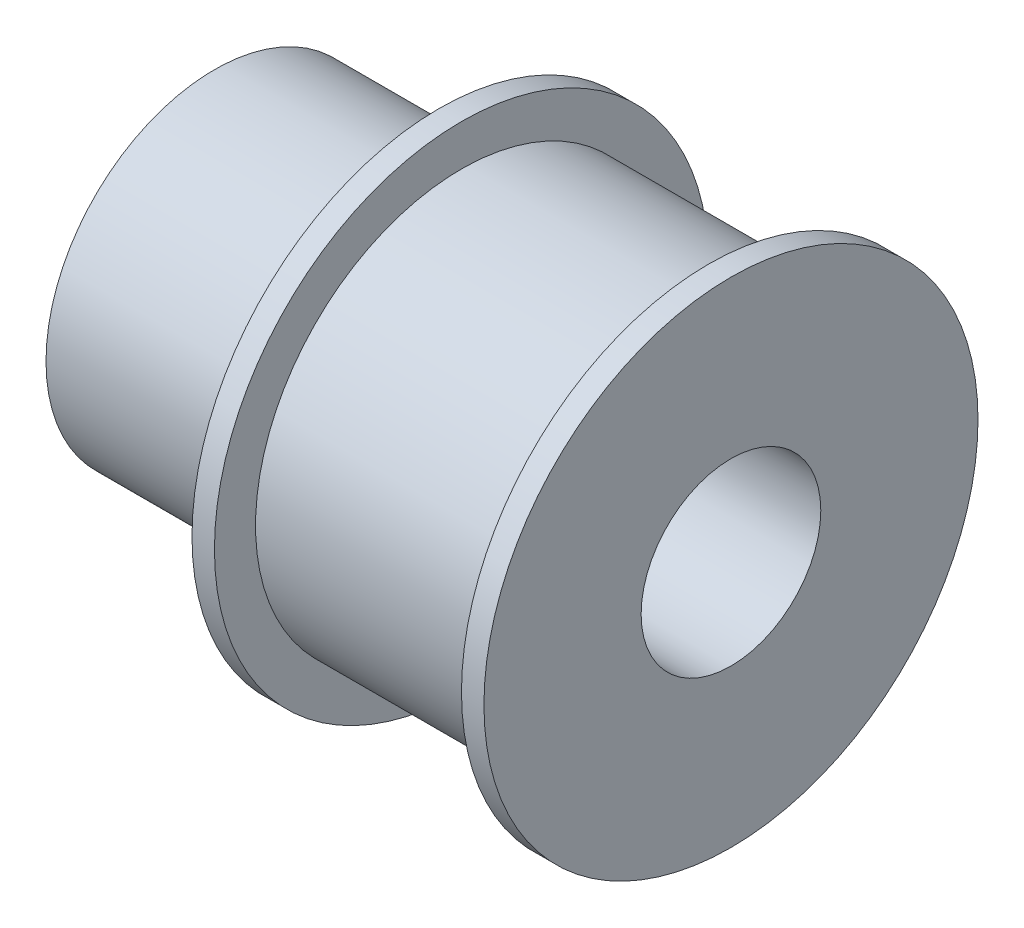
ISO-10303-21;
HEADER;
FILE_DESCRIPTION(('STEP AP214'),'2;1');
FILE_NAME('part.step','',(''),(''),'','','');
FILE_SCHEMA(('AUTOMOTIVE_DESIGN { 1 0 10303 214 1 1 1 1 }'));
ENDSEC;
DATA;
#1=APPLICATION_CONTEXT('core data for automotive mechanical design processes');
#2=APPLICATION_PROTOCOL_DEFINITION('international standard','automotive_design',2000,#1);
#3=PRODUCT_CONTEXT('',#1,'mechanical');
#4=PRODUCT('Part','Part','',(#3));
#5=PRODUCT_RELATED_PRODUCT_CATEGORY('part','',(#4));
#6=PRODUCT_DEFINITION_FORMATION('','',#4);
#7=PRODUCT_DEFINITION_CONTEXT('part definition',#1,'design');
#8=PRODUCT_DEFINITION('design','',#6,#7);
#9=PRODUCT_DEFINITION_SHAPE('','',#8);
#10=(LENGTH_UNIT() NAMED_UNIT(*) SI_UNIT(.MILLI.,.METRE.));
#11=(NAMED_UNIT(*) PLANE_ANGLE_UNIT() SI_UNIT($,.RADIAN.));
#12=(NAMED_UNIT(*) SI_UNIT($,.STERADIAN.) SOLID_ANGLE_UNIT());
#13=UNCERTAINTY_MEASURE_WITH_UNIT(LENGTH_MEASURE(1.E-05),#10,'distance_accuracy_value','');
#14=(GEOMETRIC_REPRESENTATION_CONTEXT(3) GLOBAL_UNCERTAINTY_ASSIGNED_CONTEXT((#13)) GLOBAL_UNIT_ASSIGNED_CONTEXT((#10,
#11,#12)) REPRESENTATION_CONTEXT('',''));
#15=CARTESIAN_POINT('',(0.,0.,0.));
#16=DIRECTION('',(0.,0.,1.));
#17=DIRECTION('',(1.,0.,0.));
#18=AXIS2_PLACEMENT_3D('',#15,#16,#17);
#19=CARTESIAN_POINT('',(13.,0.,0.));
#20=DIRECTION('',(-1.,0.,0.));
#21=DIRECTION('',(0.,0.,1.));
#22=AXIS2_PLACEMENT_3D('',#19,#20,#21);
#23=CYLINDRICAL_SURFACE('',#22,11.);
#24=CARTESIAN_POINT('',(0.,0.,0.));
#25=DIRECTION('',(1.,0.,0.));
#26=DIRECTION('',(0.,0.,-1.));
#27=AXIS2_PLACEMENT_3D('',#24,#25,#26);
#28=CIRCLE('',#27,11.);
#29=CARTESIAN_POINT('',(0.,0.,11.));
#30=VERTEX_POINT('',#29);
#31=EDGE_CURVE('E45',#30,#30,#28,.T.);
#32=CARTESIAN_POINT('',(1.,0.,0.));
#33=DIRECTION('',(1.,0.,0.));
#34=DIRECTION('',(0.,0.,-1.));
#35=AXIS2_PLACEMENT_3D('',#32,#33,#34);
#36=CIRCLE('',#35,11.);
#37=CARTESIAN_POINT('',(1.,0.,11.));
#38=VERTEX_POINT('',#37);
#39=EDGE_CURVE('E69',#38,#38,#36,.T.);
#40=CARTESIAN_POINT('',(0.,0.,11.));
#41=CARTESIAN_POINT('',(0.0104166666666667,0.,11.));
#42=CARTESIAN_POINT('',(0.0208333333333333,0.,11.));
#43=CARTESIAN_POINT('',(0.0416666666666667,0.,11.));
#44=CARTESIAN_POINT('',(0.0520833333333334,0.,11.));
#45=CARTESIAN_POINT('',(0.0729166666666667,0.,11.));
#46=CARTESIAN_POINT('',(0.0833333333333334,0.,11.));
#47=CARTESIAN_POINT('',(0.104166666666667,0.,11.));
#48=CARTESIAN_POINT('',(0.114583333333333,0.,11.));
#49=CARTESIAN_POINT('',(0.135416666666667,0.,11.));
#50=CARTESIAN_POINT('',(0.145833333333333,0.,11.));
#51=CARTESIAN_POINT('',(0.166666666666667,0.,11.));
#52=CARTESIAN_POINT('',(0.177083333333333,0.,11.));
#53=CARTESIAN_POINT('',(0.197916666666667,0.,11.));
#54=CARTESIAN_POINT('',(0.208333333333334,0.,11.));
#55=CARTESIAN_POINT('',(0.229166666666667,0.,11.));
#56=CARTESIAN_POINT('',(0.239583333333334,0.,11.));
#57=CARTESIAN_POINT('',(0.260416666666667,0.,11.));
#58=CARTESIAN_POINT('',(0.270833333333334,0.,11.));
#59=CARTESIAN_POINT('',(0.291666666666667,0.,11.));
#60=CARTESIAN_POINT('',(0.302083333333334,0.,11.));
#61=CARTESIAN_POINT('',(0.322916666666667,0.,11.));
#62=CARTESIAN_POINT('',(0.333333333333334,0.,11.));
#63=CARTESIAN_POINT('',(0.354166666666667,0.,11.));
#64=CARTESIAN_POINT('',(0.364583333333334,0.,11.));
#65=CARTESIAN_POINT('',(0.385416666666667,0.,11.));
#66=CARTESIAN_POINT('',(0.395833333333334,0.,11.));
#67=CARTESIAN_POINT('',(0.416666666666667,0.,11.));
#68=CARTESIAN_POINT('',(0.427083333333334,0.,11.));
#69=CARTESIAN_POINT('',(0.447916666666667,0.,11.));
#70=CARTESIAN_POINT('',(0.458333333333334,0.,11.));
#71=CARTESIAN_POINT('',(0.479166666666667,0.,11.));
#72=CARTESIAN_POINT('',(0.489583333333334,0.,11.));
#73=CARTESIAN_POINT('',(0.510416666666667,0.,11.));
#74=CARTESIAN_POINT('',(0.520833333333334,0.,11.));
#75=CARTESIAN_POINT('',(0.541666666666667,0.,11.));
#76=CARTESIAN_POINT('',(0.552083333333334,0.,11.));
#77=CARTESIAN_POINT('',(0.572916666666667,0.,11.));
#78=CARTESIAN_POINT('',(0.583333333333334,0.,11.));
#79=CARTESIAN_POINT('',(0.604166666666667,0.,11.));
#80=CARTESIAN_POINT('',(0.614583333333334,0.,11.));
#81=CARTESIAN_POINT('',(0.635416666666667,0.,11.));
#82=CARTESIAN_POINT('',(0.645833333333334,0.,11.));
#83=CARTESIAN_POINT('',(0.666666666666667,0.,11.));
#84=CARTESIAN_POINT('',(0.677083333333334,0.,11.));
#85=CARTESIAN_POINT('',(0.697916666666667,0.,11.));
#86=CARTESIAN_POINT('',(0.708333333333334,0.,11.));
#87=CARTESIAN_POINT('',(0.729166666666667,0.,11.));
#88=CARTESIAN_POINT('',(0.739583333333334,0.,11.));
#89=CARTESIAN_POINT('',(0.760416666666667,0.,11.));
#90=CARTESIAN_POINT('',(0.770833333333334,0.,11.));
#91=CARTESIAN_POINT('',(0.791666666666667,0.,11.));
#92=CARTESIAN_POINT('',(0.802083333333334,0.,11.));
#93=CARTESIAN_POINT('',(0.822916666666667,0.,11.));
#94=CARTESIAN_POINT('',(0.833333333333334,0.,11.));
#95=CARTESIAN_POINT('',(0.854166666666667,0.,11.));
#96=CARTESIAN_POINT('',(0.864583333333334,0.,11.));
#97=CARTESIAN_POINT('',(0.885416666666668,0.,11.));
#98=CARTESIAN_POINT('',(0.895833333333334,0.,11.));
#99=CARTESIAN_POINT('',(0.916666666666668,0.,11.));
#100=CARTESIAN_POINT('',(0.927083333333334,0.,11.));
#101=CARTESIAN_POINT('',(0.947916666666668,0.,11.));
#102=CARTESIAN_POINT('',(0.958333333333334,0.,11.));
#103=CARTESIAN_POINT('',(0.979166666666668,0.,11.));
#104=CARTESIAN_POINT('',(0.989583333333334,0.,11.));
#105=CARTESIAN_POINT('',(1.,0.,11.));
#106=B_SPLINE_CURVE_WITH_KNOTS('',3,(#40,#41,#42,#43,#44,#45,#46,#47,#48,#49,#50,#51,#52,#53,
#54,#55,#56,#57,#58,#59,#60,#61,#62,#63,#64,#65,#66,#67,#68,#69,#70,#71,#72,#73,#74,#75,#76,#77,
#78,#79,#80,#81,#82,#83,#84,#85,#86,#87,#88,#89,#90,#91,#92,#93,#94,#95,#96,#97,#98,#99,#100,
#101,#102,#103,#104,#105),.UNSPECIFIED.,.F.,.F.,(4,2,2,2,2,2,2,2,2,2,2,2,2,2,2,2,2,2,2,2,2,2,2,
2,2,2,2,2,2,2,2,2,4),(0.,0.03125,0.0625000000000001,0.0937500000000001,0.125,0.15625,0.1875,
0.21875,0.25,0.28125,0.3125,0.34375,0.375,0.40625,0.4375,0.46875,0.5,0.53125,0.5625,
0.593750000000001,0.625000000000001,0.656250000000001,0.687500000000001,0.718750000000001,
0.750000000000001,0.781250000000001,0.812500000000001,0.843750000000001,0.875000000000001,
0.906250000000001,0.937500000000001,0.968750000000001,1.),.UNSPECIFIED.);
#107=EDGE_CURVE('BSEAM41',#30,#38,#106,.T.);
#108=ORIENTED_EDGE('',*,*,#31,.T.);
#109=ORIENTED_EDGE('',*,*,#39,.F.);
#110=ORIENTED_EDGE('',*,*,#107,.T.);
#111=ORIENTED_EDGE('',*,*,#107,.F.);
#112=EDGE_LOOP('',(#108,#110,#109,#111));
#113=FACE_BOUND('',#112,.T.);
#114=ADVANCED_FACE('F41',(#113),#23,.T.);
#115=CARTESIAN_POINT('',(0.,0.,0.));
#116=DIRECTION('',(1.,0.,0.));
#117=DIRECTION('',(0.,0.,-1.));
#118=AXIS2_PLACEMENT_3D('',#115,#116,#117);
#119=PLANE('',#118);
#120=CARTESIAN_POINT('',(0.,0.,0.));
#121=DIRECTION('',(-1.,0.,0.));
#122=DIRECTION('',(0.,0.,1.));
#123=AXIS2_PLACEMENT_3D('',#120,#121,#122);
#124=CIRCLE('',#123,7.5);
#125=CARTESIAN_POINT('',(0.,0.,7.5));
#126=VERTEX_POINT('',#125);
#127=EDGE_CURVE('E10',#126,#126,#124,.T.);
#128=ORIENTED_EDGE('',*,*,#127,.F.);
#129=EDGE_LOOP('',(#128));
#130=FACE_BOUND('',#129,.T.);
#131=ORIENTED_EDGE('',*,*,#31,.F.);
#132=EDGE_LOOP('',(#131));
#133=FACE_BOUND('',#132,.T.);
#134=ADVANCED_FACE('F92',(#130,#133),#119,.F.);
#135=CARTESIAN_POINT('',(1.,0.,0.));
#136=DIRECTION('',(1.,0.,0.));
#137=DIRECTION('',(0.,0.,-1.));
#138=AXIS2_PLACEMENT_3D('',#135,#136,#137);
#139=PLANE('',#138);
#140=CARTESIAN_POINT('',(1.,0.,0.));
#141=DIRECTION('',(1.,0.,0.));
#142=DIRECTION('',(0.,0.,-1.));
#143=AXIS2_PLACEMENT_3D('',#140,#141,#142);
#144=CIRCLE('',#143,9.17);
#145=CARTESIAN_POINT('',(1.,0.,-9.17));
#146=VERTEX_POINT('',#145);
#147=EDGE_CURVE('E60',#146,#146,#144,.T.);
#148=ORIENTED_EDGE('',*,*,#147,.F.);
#149=EDGE_LOOP('',(#148));
#150=FACE_BOUND('',#149,.T.);
#151=ORIENTED_EDGE('',*,*,#39,.T.);
#152=EDGE_LOOP('',(#151));
#153=FACE_BOUND('',#152,.T.);
#154=ADVANCED_FACE('F82',(#150,#153),#139,.T.);
#155=CARTESIAN_POINT('',(12.,0.,0.));
#156=DIRECTION('',(1.,0.,0.));
#157=DIRECTION('',(0.,0.,-1.));
#158=AXIS2_PLACEMENT_3D('',#155,#156,#157);
#159=PLANE('',#158);
#160=CARTESIAN_POINT('',(12.,0.,0.));
#161=DIRECTION('',(1.,0.,0.));
#162=DIRECTION('',(0.,0.,-1.));
#163=AXIS2_PLACEMENT_3D('',#160,#161,#162);
#164=CIRCLE('',#163,9.17);
#165=CARTESIAN_POINT('',(12.,0.,-9.17));
#166=VERTEX_POINT('',#165);
#167=EDGE_CURVE('E65',#166,#166,#164,.T.);
#168=ORIENTED_EDGE('',*,*,#167,.T.);
#169=EDGE_LOOP('',(#168));
#170=FACE_BOUND('',#169,.T.);
#171=CARTESIAN_POINT('',(12.,0.,0.));
#172=DIRECTION('',(1.,0.,0.));
#173=DIRECTION('',(0.,0.,-1.));
#174=AXIS2_PLACEMENT_3D('',#171,#172,#173);
#175=CIRCLE('',#174,11.);
#176=CARTESIAN_POINT('',(12.,0.,11.));
#177=VERTEX_POINT('',#176);
#178=EDGE_CURVE('E64',#177,#177,#175,.T.);
#179=ORIENTED_EDGE('',*,*,#178,.F.);
#180=EDGE_LOOP('',(#179));
#181=FACE_BOUND('',#180,.T.);
#182=ADVANCED_FACE('F79',(#170,#181),#159,.F.);
#183=CARTESIAN_POINT('',(1.,0.,0.));
#184=DIRECTION('',(1.,0.,0.));
#185=DIRECTION('',(0.,0.,-1.));
#186=AXIS2_PLACEMENT_3D('',#183,#184,#185);
#187=CYLINDRICAL_SURFACE('',#186,9.17);
#188=ORIENTED_EDGE('',*,*,#147,.T.);
#189=EDGE_LOOP('',(#188));
#190=FACE_BOUND('',#189,.T.);
#191=ORIENTED_EDGE('',*,*,#167,.F.);
#192=EDGE_LOOP('',(#191));
#193=FACE_BOUND('',#192,.T.);
#194=ADVANCED_FACE('F81',(#190,#193),#187,.T.);
#195=CARTESIAN_POINT('',(13.,0.,0.));
#196=DIRECTION('',(1.,0.,0.));
#197=DIRECTION('',(0.,0.,-1.));
#198=AXIS2_PLACEMENT_3D('',#195,#196,#197);
#199=PLANE('',#198);
#200=CARTESIAN_POINT('',(13.,0.,0.));
#201=DIRECTION('',(1.,0.,0.));
#202=DIRECTION('',(0.,0.,-1.));
#203=AXIS2_PLACEMENT_3D('',#200,#201,#202);
#204=CIRCLE('',#203,4.);
#205=CARTESIAN_POINT('',(13.,0.,-4.));
#206=VERTEX_POINT('',#205);
#207=EDGE_CURVE('E119',#206,#206,#204,.F.);
#208=ORIENTED_EDGE('',*,*,#207,.T.);
#209=EDGE_LOOP('',(#208));
#210=FACE_BOUND('',#209,.T.);
#211=CARTESIAN_POINT('',(13.,0.,0.));
#212=DIRECTION('',(1.,0.,0.));
#213=DIRECTION('',(0.,0.,-1.));
#214=AXIS2_PLACEMENT_3D('',#211,#212,#213);
#215=CIRCLE('',#214,11.);
#216=CARTESIAN_POINT('',(13.,0.,11.));
#217=VERTEX_POINT('',#216);
#218=EDGE_CURVE('E50',#217,#217,#215,.T.);
#219=ORIENTED_EDGE('',*,*,#218,.T.);
#220=EDGE_LOOP('',(#219));
#221=FACE_BOUND('',#220,.T.);
#222=ADVANCED_FACE('F89',(#210,#221),#199,.T.);
#223=CARTESIAN_POINT('',(12.,0.,11.));
#224=CARTESIAN_POINT('',(12.0104166666667,0.,11.));
#225=CARTESIAN_POINT('',(12.0208333333333,0.,11.));
#226=CARTESIAN_POINT('',(12.0416666666667,0.,11.));
#227=CARTESIAN_POINT('',(12.0520833333333,0.,11.));
#228=CARTESIAN_POINT('',(12.0729166666667,0.,11.));
#229=CARTESIAN_POINT('',(12.0833333333333,0.,11.));
#230=CARTESIAN_POINT('',(12.1041666666667,0.,11.));
#231=CARTESIAN_POINT('',(12.1145833333333,0.,11.));
#232=CARTESIAN_POINT('',(12.1354166666667,0.,11.));
#233=CARTESIAN_POINT('',(12.1458333333333,0.,11.));
#234=CARTESIAN_POINT('',(12.1666666666667,0.,11.));
#235=CARTESIAN_POINT('',(12.1770833333333,0.,11.));
#236=CARTESIAN_POINT('',(12.1979166666667,0.,11.));
#237=CARTESIAN_POINT('',(12.2083333333333,0.,11.));
#238=CARTESIAN_POINT('',(12.2291666666667,0.,11.));
#239=CARTESIAN_POINT('',(12.2395833333333,0.,11.));
#240=CARTESIAN_POINT('',(12.2604166666667,0.,11.));
#241=CARTESIAN_POINT('',(12.2708333333333,0.,11.));
#242=CARTESIAN_POINT('',(12.2916666666667,0.,11.));
#243=CARTESIAN_POINT('',(12.3020833333333,0.,11.));
#244=CARTESIAN_POINT('',(12.3229166666667,0.,11.));
#245=CARTESIAN_POINT('',(12.3333333333333,0.,11.));
#246=CARTESIAN_POINT('',(12.3541666666667,0.,11.));
#247=CARTESIAN_POINT('',(12.3645833333333,0.,11.));
#248=CARTESIAN_POINT('',(12.3854166666667,0.,11.));
#249=CARTESIAN_POINT('',(12.3958333333333,0.,11.));
#250=CARTESIAN_POINT('',(12.4166666666667,0.,11.));
#251=CARTESIAN_POINT('',(12.4270833333333,0.,11.));
#252=CARTESIAN_POINT('',(12.4479166666667,0.,11.));
#253=CARTESIAN_POINT('',(12.4583333333333,0.,11.));
#254=CARTESIAN_POINT('',(12.4791666666667,0.,11.));
#255=CARTESIAN_POINT('',(12.4895833333333,0.,11.));
#256=CARTESIAN_POINT('',(12.5104166666667,0.,11.));
#257=CARTESIAN_POINT('',(12.5208333333333,0.,11.));
#258=CARTESIAN_POINT('',(12.5416666666667,0.,11.));
#259=CARTESIAN_POINT('',(12.5520833333333,0.,11.));
#260=CARTESIAN_POINT('',(12.5729166666667,0.,11.));
#261=CARTESIAN_POINT('',(12.5833333333333,0.,11.));
#262=CARTESIAN_POINT('',(12.6041666666667,0.,11.));
#263=CARTESIAN_POINT('',(12.6145833333333,0.,11.));
#264=CARTESIAN_POINT('',(12.6354166666667,0.,11.));
#265=CARTESIAN_POINT('',(12.6458333333333,0.,11.));
#266=CARTESIAN_POINT('',(12.6666666666667,0.,11.));
#267=CARTESIAN_POINT('',(12.6770833333333,0.,11.));
#268=CARTESIAN_POINT('',(12.6979166666667,0.,11.));
#269=CARTESIAN_POINT('',(12.7083333333333,0.,11.));
#270=CARTESIAN_POINT('',(12.7291666666667,0.,11.));
#271=CARTESIAN_POINT('',(12.7395833333333,0.,11.));
#272=CARTESIAN_POINT('',(12.7604166666667,0.,11.));
#273=CARTESIAN_POINT('',(12.7708333333333,0.,11.));
#274=CARTESIAN_POINT('',(12.7916666666667,0.,11.));
#275=CARTESIAN_POINT('',(12.8020833333333,0.,11.));
#276=CARTESIAN_POINT('',(12.8229166666667,0.,11.));
#277=CARTESIAN_POINT('',(12.8333333333333,0.,11.));
#278=CARTESIAN_POINT('',(12.8541666666667,0.,11.));
#279=CARTESIAN_POINT('',(12.8645833333333,0.,11.));
#280=CARTESIAN_POINT('',(12.8854166666667,0.,11.));
#281=CARTESIAN_POINT('',(12.8958333333333,0.,11.));
#282=CARTESIAN_POINT('',(12.9166666666667,0.,11.));
#283=CARTESIAN_POINT('',(12.9270833333333,0.,11.));
#284=CARTESIAN_POINT('',(12.9479166666667,0.,11.));
#285=CARTESIAN_POINT('',(12.9583333333333,0.,11.));
#286=CARTESIAN_POINT('',(12.9791666666667,0.,11.));
#287=CARTESIAN_POINT('',(12.9895833333333,0.,11.));
#288=CARTESIAN_POINT('',(13.,0.,11.));
#289=B_SPLINE_CURVE_WITH_KNOTS('',3,(#223,#224,#225,#226,#227,#228,#229,#230,#231,#232,#233,
#234,#235,#236,#237,#238,#239,#240,#241,#242,#243,#244,#245,#246,#247,#248,#249,#250,#251,#252,
#253,#254,#255,#256,#257,#258,#259,#260,#261,#262,#263,#264,#265,#266,#267,#268,#269,#270,#271,
#272,#273,#274,#275,#276,#277,#278,#279,#280,#281,#282,#283,#284,#285,#286,#287,#288),
.UNSPECIFIED.,.F.,.F.,(4,2,2,2,2,2,2,2,2,2,2,2,2,2,2,2,2,2,2,2,2,2,2,2,2,2,2,2,2,2,2,2,4),(0.,
0.03125,0.0625000000000001,0.0937500000000001,0.125,0.15625,0.1875,0.21875,0.25,0.28125,0.3125,
0.34375,0.375,0.40625,0.4375,0.46875,0.5,0.53125,0.5625,0.593750000000001,0.625000000000001,
0.656250000000001,0.687500000000001,0.718750000000001,0.750000000000001,0.781250000000001,
0.812500000000001,0.843750000000001,0.875000000000001,0.906250000000001,0.937500000000001,
0.968750000000001,1.),.UNSPECIFIED.);
#290=EDGE_CURVE('BSEAM43',#177,#217,#289,.T.);
#291=ORIENTED_EDGE('',*,*,#178,.T.);
#292=ORIENTED_EDGE('',*,*,#218,.F.);
#293=ORIENTED_EDGE('',*,*,#290,.T.);
#294=ORIENTED_EDGE('',*,*,#290,.F.);
#295=EDGE_LOOP('',(#291,#293,#292,#294));
#296=FACE_BOUND('',#295,.T.);
#297=ADVANCED_FACE('F43',(#296),#23,.T.);
#298=CARTESIAN_POINT('',(-10.,0.,0.));
#299=DIRECTION('',(1.,0.,0.));
#300=DIRECTION('',(0.,0.,-1.));
#301=AXIS2_PLACEMENT_3D('',#298,#299,#300);
#302=CYLINDRICAL_SURFACE('',#301,7.5);
#303=CARTESIAN_POINT('',(-10.,0.,0.));
#304=DIRECTION('',(-1.,0.,0.));
#305=DIRECTION('',(0.,0.,1.));
#306=AXIS2_PLACEMENT_3D('',#303,#304,#305);
#307=CIRCLE('',#306,7.5);
#308=CARTESIAN_POINT('',(-10.,0.,7.5));
#309=VERTEX_POINT('',#308);
#310=EDGE_CURVE('E58',#309,#309,#307,.T.);
#311=ORIENTED_EDGE('',*,*,#310,.F.);
#312=EDGE_LOOP('',(#311));
#313=FACE_BOUND('',#312,.T.);
#314=ORIENTED_EDGE('',*,*,#127,.T.);
#315=EDGE_LOOP('',(#314));
#316=FACE_BOUND('',#315,.T.);
#317=ADVANCED_FACE('F105',(#313,#316),#302,.T.);
#318=CARTESIAN_POINT('',(-10.,0.,0.));
#319=DIRECTION('',(-1.,0.,0.));
#320=DIRECTION('',(0.,0.,1.));
#321=AXIS2_PLACEMENT_3D('',#318,#319,#320);
#322=PLANE('',#321);
#323=CARTESIAN_POINT('',(-10.,0.,0.));
#324=DIRECTION('',(-1.,0.,0.));
#325=DIRECTION('',(0.,0.,1.));
#326=AXIS2_PLACEMENT_3D('',#323,#324,#325);
#327=CIRCLE('',#326,4.);
#328=CARTESIAN_POINT('',(-10.,0.,4.));
#329=VERTEX_POINT('',#328);
#330=EDGE_CURVE('E123',#329,#329,#327,.T.);
#331=ORIENTED_EDGE('',*,*,#330,.F.);
#332=EDGE_LOOP('',(#331));
#333=FACE_BOUND('',#332,.T.);
#334=ORIENTED_EDGE('',*,*,#310,.T.);
#335=EDGE_LOOP('',(#334));
#336=FACE_BOUND('',#335,.T.);
#337=ADVANCED_FACE('F110',(#333,#336),#322,.T.);
#338=CARTESIAN_POINT('',(13.001,0.,0.));
#339=DIRECTION('',(-1.,0.,0.));
#340=DIRECTION('',(0.,0.,1.));
#341=AXIS2_PLACEMENT_3D('',#338,#339,#340);
#342=CYLINDRICAL_SURFACE('',#341,4.);
#343=ORIENTED_EDGE('',*,*,#207,.F.);
#344=EDGE_LOOP('',(#343));
#345=FACE_BOUND('',#344,.T.);
#346=ORIENTED_EDGE('',*,*,#330,.T.);
#347=EDGE_LOOP('',(#346));
#348=FACE_BOUND('',#347,.T.);
#349=ADVANCED_FACE('F134',(#345,#348),#342,.F.);
#350=CLOSED_SHELL('',(#114,#134,#154,#182,#194,#222,#297,#317,#337,#349));
#351=MANIFOLD_SOLID_BREP('B2',#350);
#352=ADVANCED_BREP_SHAPE_REPRESENTATION('',(#18,#351),#14);
#353=SHAPE_DEFINITION_REPRESENTATION(#9,#352);
ENDSEC;
END-ISO-10303-21;
